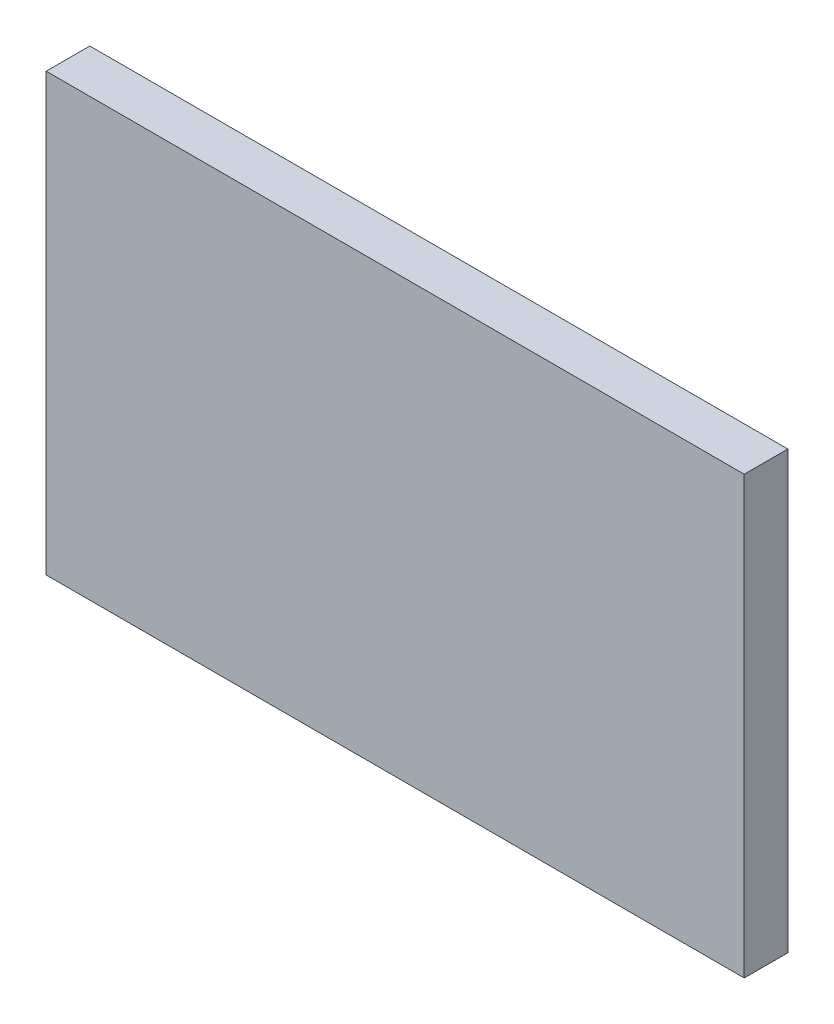
ISO-10303-21;
HEADER;
FILE_DESCRIPTION(('STEP AP214'),'2;1');
FILE_NAME('part.step','',(''),(''),'','','');
FILE_SCHEMA(('AUTOMOTIVE_DESIGN { 1 0 10303 214 1 1 1 1 }'));
ENDSEC;
DATA;
#1=APPLICATION_CONTEXT('core data for automotive mechanical design processes');
#2=APPLICATION_PROTOCOL_DEFINITION('international standard','automotive_design',2000,#1);
#3=PRODUCT_CONTEXT('',#1,'mechanical');
#4=PRODUCT('Part','Part','',(#3));
#5=PRODUCT_RELATED_PRODUCT_CATEGORY('part','',(#4));
#6=PRODUCT_DEFINITION_FORMATION('','',#4);
#7=PRODUCT_DEFINITION_CONTEXT('part definition',#1,'design');
#8=PRODUCT_DEFINITION('design','',#6,#7);
#9=PRODUCT_DEFINITION_SHAPE('','',#8);
#10=(LENGTH_UNIT() NAMED_UNIT(*) SI_UNIT(.MILLI.,.METRE.));
#11=(NAMED_UNIT(*) PLANE_ANGLE_UNIT() SI_UNIT($,.RADIAN.));
#12=(NAMED_UNIT(*) SI_UNIT($,.STERADIAN.) SOLID_ANGLE_UNIT());
#13=UNCERTAINTY_MEASURE_WITH_UNIT(LENGTH_MEASURE(1.E-05),#10,'distance_accuracy_value','');
#14=(GEOMETRIC_REPRESENTATION_CONTEXT(3) GLOBAL_UNCERTAINTY_ASSIGNED_CONTEXT((#13)) GLOBAL_UNIT_ASSIGNED_CONTEXT((#10,
#11,#12)) REPRESENTATION_CONTEXT('',''));
#15=CARTESIAN_POINT('',(0.,0.,0.));
#16=DIRECTION('',(0.,0.,1.));
#17=DIRECTION('',(1.,0.,0.));
#18=AXIS2_PLACEMENT_3D('',#15,#16,#17);
#19=CARTESIAN_POINT('',(0.,0.,1.));
#20=DIRECTION('',(1.,0.,0.));
#21=DIRECTION('',(0.,1.,0.));
#22=AXIS2_PLACEMENT_3D('',#19,#20,#21);
#23=PLANE('',#22);
#24=DIRECTION('',(0.,-1.,0.));
#25=VECTOR('',#24,1.);
#26=CARTESIAN_POINT('',(0.,0.,0.));
#27=LINE('',#26,#25);
#28=CARTESIAN_POINT('',(0.,0.,0.));
#29=VERTEX_POINT('',#28);
#30=CARTESIAN_POINT('',(0.,-10.,0.));
#31=VERTEX_POINT('',#30);
#32=EDGE_CURVE('E98',#29,#31,#27,.T.);
#33=ORIENTED_EDGE('',*,*,#32,.T.);
#34=DIRECTION('',(0.,0.,-1.));
#35=VECTOR('',#34,1.);
#36=CARTESIAN_POINT('',(0.,-10.,1.));
#37=LINE('',#36,#35);
#38=CARTESIAN_POINT('',(0.,-10.,1.));
#39=VERTEX_POINT('',#38);
#40=EDGE_CURVE('E11',#39,#31,#37,.T.);
#41=ORIENTED_EDGE('',*,*,#40,.F.);
#42=DIRECTION('',(0.,-1.,0.));
#43=VECTOR('',#42,1.);
#44=CARTESIAN_POINT('',(0.,0.,1.));
#45=LINE('',#44,#43);
#46=CARTESIAN_POINT('',(0.,0.,1.));
#47=VERTEX_POINT('',#46);
#48=EDGE_CURVE('E86',#47,#39,#45,.T.);
#49=ORIENTED_EDGE('',*,*,#48,.F.);
#50=DIRECTION('',(0.,0.,-1.));
#51=VECTOR('',#50,1.);
#52=CARTESIAN_POINT('',(0.,0.,1.));
#53=LINE('',#52,#51);
#54=EDGE_CURVE('E94',#47,#29,#53,.T.);
#55=ORIENTED_EDGE('',*,*,#54,.T.);
#56=EDGE_LOOP('',(#33,#41,#49,#55));
#57=FACE_BOUND('',#56,.T.);
#58=ADVANCED_FACE('F35',(#57),#23,.F.);
#59=CARTESIAN_POINT('',(0.,-10.,1.));
#60=DIRECTION('',(0.,1.,0.));
#61=DIRECTION('',(0.,0.,1.));
#62=AXIS2_PLACEMENT_3D('',#59,#60,#61);
#63=PLANE('',#62);
#64=DIRECTION('',(1.,0.,0.));
#65=VECTOR('',#64,1.);
#66=CARTESIAN_POINT('',(0.,-10.,0.));
#67=LINE('',#66,#65);
#68=CARTESIAN_POINT('',(16.,-10.,0.));
#69=VERTEX_POINT('',#68);
#70=EDGE_CURVE('E90',#31,#69,#67,.T.);
#71=ORIENTED_EDGE('',*,*,#70,.T.);
#72=DIRECTION('',(0.,0.,-1.));
#73=VECTOR('',#72,1.);
#74=CARTESIAN_POINT('',(16.,-10.,1.));
#75=LINE('',#74,#73);
#76=CARTESIAN_POINT('',(16.,-10.,1.));
#77=VERTEX_POINT('',#76);
#78=EDGE_CURVE('E43',#77,#69,#75,.T.);
#79=ORIENTED_EDGE('',*,*,#78,.F.);
#80=DIRECTION('',(1.,0.,0.));
#81=VECTOR('',#80,1.);
#82=CARTESIAN_POINT('',(0.,-10.,1.));
#83=LINE('',#82,#81);
#84=EDGE_CURVE('E81',#39,#77,#83,.T.);
#85=ORIENTED_EDGE('',*,*,#84,.F.);
#86=ORIENTED_EDGE('',*,*,#40,.T.);
#87=EDGE_LOOP('',(#71,#79,#85,#86));
#88=FACE_BOUND('',#87,.T.);
#89=ADVANCED_FACE('F89',(#88),#63,.F.);
#90=CARTESIAN_POINT('',(16.,0.,1.));
#91=DIRECTION('',(-1.,0.,0.));
#92=DIRECTION('',(0.,0.,1.));
#93=AXIS2_PLACEMENT_3D('',#90,#91,#92);
#94=PLANE('',#93);
#95=DIRECTION('',(0.,1.,0.));
#96=VECTOR('',#95,1.);
#97=CARTESIAN_POINT('',(16.,0.,0.));
#98=LINE('',#97,#96);
#99=CARTESIAN_POINT('',(16.,0.,0.));
#100=VERTEX_POINT('',#99);
#101=EDGE_CURVE('E68',#69,#100,#98,.T.);
#102=ORIENTED_EDGE('',*,*,#101,.T.);
#103=DIRECTION('',(0.,0.,-1.));
#104=VECTOR('',#103,1.);
#105=CARTESIAN_POINT('',(16.,0.,1.));
#106=LINE('',#105,#104);
#107=CARTESIAN_POINT('',(16.,0.,1.));
#108=VERTEX_POINT('',#107);
#109=EDGE_CURVE('E91',#108,#100,#106,.T.);
#110=ORIENTED_EDGE('',*,*,#109,.F.);
#111=DIRECTION('',(0.,1.,0.));
#112=VECTOR('',#111,1.);
#113=CARTESIAN_POINT('',(16.,0.,1.));
#114=LINE('',#113,#112);
#115=EDGE_CURVE('E84',#77,#108,#114,.T.);
#116=ORIENTED_EDGE('',*,*,#115,.F.);
#117=ORIENTED_EDGE('',*,*,#78,.T.);
#118=EDGE_LOOP('',(#102,#110,#116,#117));
#119=FACE_BOUND('',#118,.T.);
#120=ADVANCED_FACE('F92',(#119),#94,.F.);
#121=CARTESIAN_POINT('',(0.,0.,1.));
#122=DIRECTION('',(0.,-1.,0.));
#123=DIRECTION('',(0.,0.,-1.));
#124=AXIS2_PLACEMENT_3D('',#121,#122,#123);
#125=PLANE('',#124);
#126=DIRECTION('',(-1.,0.,0.));
#127=VECTOR('',#126,1.);
#128=CARTESIAN_POINT('',(0.,0.,0.));
#129=LINE('',#128,#127);
#130=EDGE_CURVE('E74',#100,#29,#129,.T.);
#131=ORIENTED_EDGE('',*,*,#130,.T.);
#132=ORIENTED_EDGE('',*,*,#54,.F.);
#133=DIRECTION('',(-1.,0.,0.));
#134=VECTOR('',#133,1.);
#135=CARTESIAN_POINT('',(0.,0.,1.));
#136=LINE('',#135,#134);
#137=EDGE_CURVE('E51',#108,#47,#136,.T.);
#138=ORIENTED_EDGE('',*,*,#137,.F.);
#139=ORIENTED_EDGE('',*,*,#109,.T.);
#140=EDGE_LOOP('',(#131,#132,#138,#139));
#141=FACE_BOUND('',#140,.T.);
#142=ADVANCED_FACE('F105',(#141),#125,.F.);
#143=CARTESIAN_POINT('',(0.,-10.,1.));
#144=DIRECTION('',(0.,0.,1.));
#145=DIRECTION('',(1.,0.,0.));
#146=AXIS2_PLACEMENT_3D('',#143,#144,#145);
#147=PLANE('',#146);
#148=ORIENTED_EDGE('',*,*,#48,.T.);
#149=ORIENTED_EDGE('',*,*,#84,.T.);
#150=ORIENTED_EDGE('',*,*,#115,.T.);
#151=ORIENTED_EDGE('',*,*,#137,.T.);
#152=EDGE_LOOP('',(#148,#149,#150,#151));
#153=FACE_BOUND('',#152,.T.);
#154=ADVANCED_FACE('F82',(#153),#147,.T.);
#155=CARTESIAN_POINT('',(0.,-10.,0.));
#156=DIRECTION('',(0.,0.,1.));
#157=DIRECTION('',(1.,0.,0.));
#158=AXIS2_PLACEMENT_3D('',#155,#156,#157);
#159=PLANE('',#158);
#160=ORIENTED_EDGE('',*,*,#32,.F.);
#161=ORIENTED_EDGE('',*,*,#130,.F.);
#162=ORIENTED_EDGE('',*,*,#101,.F.);
#163=ORIENTED_EDGE('',*,*,#70,.F.);
#164=EDGE_LOOP('',(#160,#161,#162,#163));
#165=FACE_BOUND('',#164,.T.);
#166=ADVANCED_FACE('F108',(#165),#159,.F.);
#167=CLOSED_SHELL('',(#58,#89,#120,#142,#154,#166));
#168=MANIFOLD_SOLID_BREP('B2',#167);
#169=ADVANCED_BREP_SHAPE_REPRESENTATION('',(#18,#168),#14);
#170=SHAPE_DEFINITION_REPRESENTATION(#9,#169);
ENDSEC;
END-ISO-10303-21;
